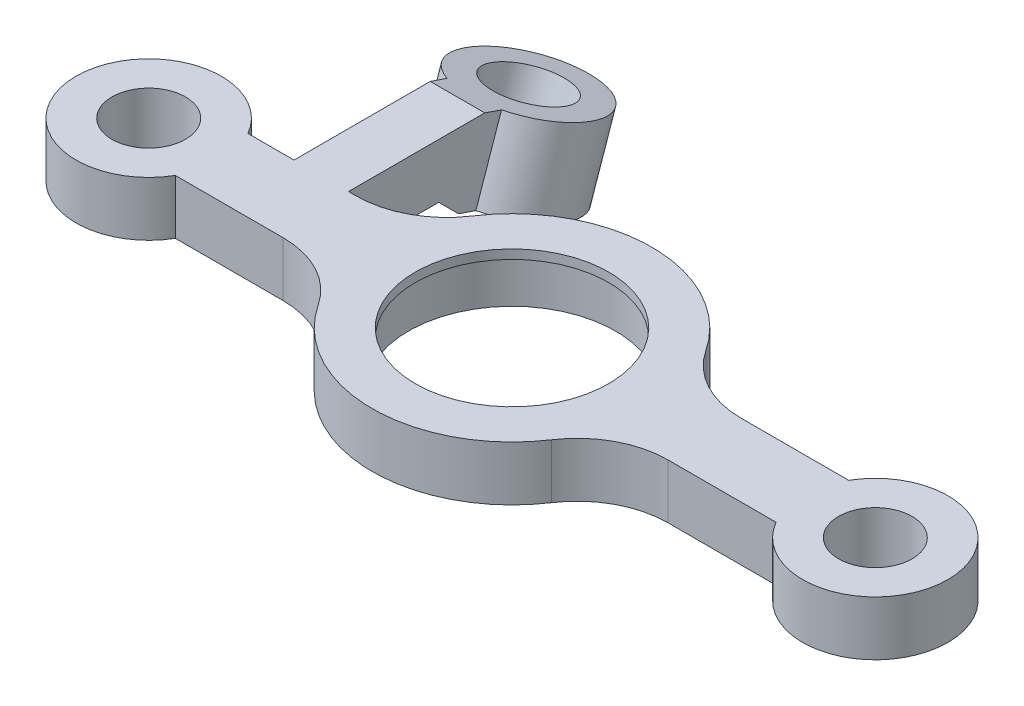
ISO-10303-21;
HEADER;
FILE_DESCRIPTION(('STEP AP214'),'2;1');
FILE_NAME('part.step','',(''),(''),'','','');
FILE_SCHEMA(('AUTOMOTIVE_DESIGN { 1 0 10303 214 1 1 1 1 }'));
ENDSEC;
DATA;
#1=APPLICATION_CONTEXT('core data for automotive mechanical design processes');
#2=APPLICATION_PROTOCOL_DEFINITION('international standard','automotive_design',2000,#1);
#3=PRODUCT_CONTEXT('',#1,'mechanical');
#4=PRODUCT('Part','Part','',(#3));
#5=PRODUCT_RELATED_PRODUCT_CATEGORY('part','',(#4));
#6=PRODUCT_DEFINITION_FORMATION('','',#4);
#7=PRODUCT_DEFINITION_CONTEXT('part definition',#1,'design');
#8=PRODUCT_DEFINITION('design','',#6,#7);
#9=PRODUCT_DEFINITION_SHAPE('','',#8);
#10=(LENGTH_UNIT() NAMED_UNIT(*) SI_UNIT(.MILLI.,.METRE.));
#11=(NAMED_UNIT(*) PLANE_ANGLE_UNIT() SI_UNIT($,.RADIAN.));
#12=(NAMED_UNIT(*) SI_UNIT($,.STERADIAN.) SOLID_ANGLE_UNIT());
#13=UNCERTAINTY_MEASURE_WITH_UNIT(LENGTH_MEASURE(1.E-05),#10,'distance_accuracy_value','');
#14=(GEOMETRIC_REPRESENTATION_CONTEXT(3) GLOBAL_UNCERTAINTY_ASSIGNED_CONTEXT((#13)) GLOBAL_UNIT_ASSIGNED_CONTEXT((#10,
#11,#12)) REPRESENTATION_CONTEXT('',''));
#15=CARTESIAN_POINT('',(0.,0.,0.));
#16=DIRECTION('',(0.,0.,1.));
#17=DIRECTION('',(1.,0.,0.));
#18=AXIS2_PLACEMENT_3D('',#15,#16,#17);
#19=CARTESIAN_POINT('',(-40.,0.,0.));
#20=DIRECTION('',(0.,1.,0.));
#21=DIRECTION('',(0.,0.,1.));
#22=AXIS2_PLACEMENT_3D('',#19,#20,#21);
#23=PLANE('',#22);
#24=CARTESIAN_POINT('',(0.,0.,0.));
#25=DIRECTION('',(0.,1.,0.));
#26=DIRECTION('',(0.,0.,1.));
#27=AXIS2_PLACEMENT_3D('',#24,#25,#26);
#28=CIRCLE('',#27,11.4);
#29=CARTESIAN_POINT('',(0.,0.,11.4));
#30=VERTEX_POINT('',#29);
#31=EDGE_CURVE('E208',#30,#30,#28,.T.);
#32=ORIENTED_EDGE('',*,*,#31,.T.);
#33=EDGE_LOOP('',(#32));
#34=FACE_BOUND('',#33,.T.);
#35=CARTESIAN_POINT('',(-40.,0.,0.));
#36=DIRECTION('',(0.,1.,0.));
#37=DIRECTION('',(0.,0.,1.));
#38=AXIS2_PLACEMENT_3D('',#35,#36,#37);
#39=CIRCLE('',#38,4.05);
#40=CARTESIAN_POINT('',(-40.,0.,4.05));
#41=VERTEX_POINT('',#40);
#42=EDGE_CURVE('E211',#41,#41,#39,.T.);
#43=ORIENTED_EDGE('',*,*,#42,.T.);
#44=EDGE_LOOP('',(#43));
#45=FACE_BOUND('',#44,.T.);
#46=CARTESIAN_POINT('',(40.,0.,0.));
#47=DIRECTION('',(0.,1.,0.));
#48=DIRECTION('',(0.,0.,1.));
#49=AXIS2_PLACEMENT_3D('',#46,#47,#48);
#50=CIRCLE('',#49,4.05);
#51=CARTESIAN_POINT('',(40.,0.,4.05));
#52=VERTEX_POINT('',#51);
#53=EDGE_CURVE('E215',#52,#52,#50,.T.);
#54=ORIENTED_EDGE('',*,*,#53,.T.);
#55=EDGE_LOOP('',(#54));
#56=FACE_BOUND('',#55,.T.);
#57=DIRECTION('',(0.,0.,1.));
#58=VECTOR('',#57,1.);
#59=CARTESIAN_POINT('',(-28.,0.,-4.));
#60=LINE('',#59,#58);
#61=CARTESIAN_POINT('',(-28.,0.,-13.934034320262));
#62=VERTEX_POINT('',#61);
#63=CARTESIAN_POINT('',(-28.,0.,-4.));
#64=VERTEX_POINT('',#63);
#65=EDGE_CURVE('E284',#62,#64,#60,.T.);
#66=ORIENTED_EDGE('',*,*,#65,.F.);
#67=DIRECTION('',(1.,0.,0.));
#68=VECTOR('',#67,1.);
#69=CARTESIAN_POINT('',(-22.,0.,-13.934034320262));
#70=LINE('',#69,#68);
#71=CARTESIAN_POINT('',(-22.,0.,-13.934034320262));
#72=VERTEX_POINT('',#71);
#73=EDGE_CURVE('E328',#62,#72,#70,.T.);
#74=ORIENTED_EDGE('',*,*,#73,.T.);
#75=DIRECTION('',(0.,0.,-1.));
#76=VECTOR('',#75,1.);
#77=CARTESIAN_POINT('',(-22.,0.,-19.));
#78=LINE('',#77,#76);
#79=CARTESIAN_POINT('',(-22.,0.,-4.));
#80=VERTEX_POINT('',#79);
#81=EDGE_CURVE('E282',#80,#72,#78,.T.);
#82=ORIENTED_EDGE('',*,*,#81,.F.);
#83=DIRECTION('',(-1.,0.,0.));
#84=VECTOR('',#83,1.);
#85=CARTESIAN_POINT('',(-22.,0.,-4.));
#86=LINE('',#85,#84);
#87=CARTESIAN_POINT('',(-21.193395197561,0.,-4.));
#88=VERTEX_POINT('',#87);
#89=EDGE_CURVE('E280',#88,#80,#86,.T.);
#90=ORIENTED_EDGE('',*,*,#89,.F.);
#91=CARTESIAN_POINT('',(-21.193395197561,0.,-14.));
#92=DIRECTION('',(0.,-1.,0.));
#93=DIRECTION('',(0.,0.,-1.));
#94=AXIS2_PLACEMENT_3D('',#91,#92,#93);
#95=CIRCLE('',#94,10.);
#96=CARTESIAN_POINT('',(-12.8495388205685,0.,-8.48818897637796));
#97=VERTEX_POINT('',#96);
#98=EDGE_CURVE('E278',#97,#88,#95,.T.);
#99=ORIENTED_EDGE('',*,*,#98,.F.);
#100=CARTESIAN_POINT('',(0.,0.,0.));
#101=DIRECTION('',(0.,1.,0.));
#102=DIRECTION('',(0.,0.,1.));
#103=AXIS2_PLACEMENT_3D('',#100,#101,#102);
#104=CIRCLE('',#103,15.4);
#105=CARTESIAN_POINT('',(12.8495388205685,0.,-8.48818897637795));
#106=VERTEX_POINT('',#105);
#107=EDGE_CURVE('E276',#106,#97,#104,.T.);
#108=ORIENTED_EDGE('',*,*,#107,.F.);
#109=CARTESIAN_POINT('',(21.193395197561,0.,-14.));
#110=DIRECTION('',(0.,-1.,0.));
#111=DIRECTION('',(0.,0.,-1.));
#112=AXIS2_PLACEMENT_3D('',#109,#110,#111);
#113=CIRCLE('',#112,10.);
#114=CARTESIAN_POINT('',(21.193395197561,0.,-4.));
#115=VERTEX_POINT('',#114);
#116=EDGE_CURVE('E274',#115,#106,#113,.T.);
#117=ORIENTED_EDGE('',*,*,#116,.F.);
#118=DIRECTION('',(-1.,0.,0.));
#119=VECTOR('',#118,1.);
#120=CARTESIAN_POINT('',(21.193395197561,0.,-4.));
#121=LINE('',#120,#119);
#122=CARTESIAN_POINT('',(33.0717967697245,0.,-3.99999999999999));
#123=VERTEX_POINT('',#122);
#124=EDGE_CURVE('E272',#123,#115,#121,.T.);
#125=ORIENTED_EDGE('',*,*,#124,.F.);
#126=CARTESIAN_POINT('',(40.,0.,0.));
#127=DIRECTION('',(0.,1.,0.));
#128=DIRECTION('',(0.,0.,1.));
#129=AXIS2_PLACEMENT_3D('',#126,#127,#128);
#130=CIRCLE('',#129,8.00000000000001);
#131=CARTESIAN_POINT('',(33.0717967697245,0.,3.99999999999999));
#132=VERTEX_POINT('',#131);
#133=EDGE_CURVE('E270',#132,#123,#130,.T.);
#134=ORIENTED_EDGE('',*,*,#133,.F.);
#135=DIRECTION('',(1.,0.,0.));
#136=VECTOR('',#135,1.);
#137=CARTESIAN_POINT('',(21.193395197561,0.,4.));
#138=LINE('',#137,#136);
#139=CARTESIAN_POINT('',(21.193395197561,0.,4.));
#140=VERTEX_POINT('',#139);
#141=EDGE_CURVE('E268',#140,#132,#138,.T.);
#142=ORIENTED_EDGE('',*,*,#141,.F.);
#143=CARTESIAN_POINT('',(21.193395197561,0.,14.));
#144=DIRECTION('',(0.,-1.,0.));
#145=DIRECTION('',(0.,0.,1.));
#146=AXIS2_PLACEMENT_3D('',#143,#144,#145);
#147=CIRCLE('',#146,10.);
#148=CARTESIAN_POINT('',(12.8495388205685,0.,8.48818897637795));
#149=VERTEX_POINT('',#148);
#150=EDGE_CURVE('E266',#149,#140,#147,.T.);
#151=ORIENTED_EDGE('',*,*,#150,.F.);
#152=CARTESIAN_POINT('',(0.,0.,0.));
#153=DIRECTION('',(0.,1.,0.));
#154=DIRECTION('',(0.,0.,1.));
#155=AXIS2_PLACEMENT_3D('',#152,#153,#154);
#156=CIRCLE('',#155,15.4);
#157=CARTESIAN_POINT('',(-12.8495388205685,0.,8.48818897637796));
#158=VERTEX_POINT('',#157);
#159=EDGE_CURVE('E264',#158,#149,#156,.T.);
#160=ORIENTED_EDGE('',*,*,#159,.F.);
#161=CARTESIAN_POINT('',(-21.193395197561,0.,14.));
#162=DIRECTION('',(0.,-1.,0.));
#163=DIRECTION('',(0.,0.,1.));
#164=AXIS2_PLACEMENT_3D('',#161,#162,#163);
#165=CIRCLE('',#164,10.);
#166=CARTESIAN_POINT('',(-21.193395197561,0.,4.));
#167=VERTEX_POINT('',#166);
#168=EDGE_CURVE('E262',#167,#158,#165,.T.);
#169=ORIENTED_EDGE('',*,*,#168,.F.);
#170=DIRECTION('',(1.,0.,0.));
#171=VECTOR('',#170,1.);
#172=CARTESIAN_POINT('',(-33.0717967697245,0.,4.));
#173=LINE('',#172,#171);
#174=CARTESIAN_POINT('',(-33.0717967697245,0.,4.));
#175=VERTEX_POINT('',#174);
#176=EDGE_CURVE('E260',#175,#167,#173,.T.);
#177=ORIENTED_EDGE('',*,*,#176,.F.);
#178=CARTESIAN_POINT('',(-40.,0.,0.));
#179=DIRECTION('',(0.,1.,0.));
#180=DIRECTION('',(0.,0.,1.));
#181=AXIS2_PLACEMENT_3D('',#178,#179,#180);
#182=CIRCLE('',#181,8.00000000000001);
#183=CARTESIAN_POINT('',(-33.0717967697245,0.,-3.99999999999998));
#184=VERTEX_POINT('',#183);
#185=EDGE_CURVE('E221',#184,#175,#182,.T.);
#186=ORIENTED_EDGE('',*,*,#185,.F.);
#187=DIRECTION('',(-1.,0.,0.));
#188=VECTOR('',#187,1.);
#189=CARTESIAN_POINT('',(-33.0717967697245,0.,-3.99999999999998));
#190=LINE('',#189,#188);
#191=EDGE_CURVE('E228',#64,#184,#190,.T.);
#192=ORIENTED_EDGE('',*,*,#191,.F.);
#193=EDGE_LOOP('',(#66,#74,#82,#90,#99,#108,#117,#125,#134,#142,#151,#160,#169,#177,#186,#192));
#194=FACE_BOUND('',#193,.T.);
#195=ADVANCED_FACE('F33',(#34,#45,#56,#194),#23,.F.);
#196=CARTESIAN_POINT('',(0.,6.,0.));
#197=DIRECTION('',(0.,-1.,0.));
#198=DIRECTION('',(0.,0.,-1.));
#199=AXIS2_PLACEMENT_3D('',#196,#197,#198);
#200=CYLINDRICAL_SURFACE('',#199,11.4);
#201=ORIENTED_EDGE('',*,*,#31,.F.);
#202=EDGE_LOOP('',(#201));
#203=FACE_BOUND('',#202,.T.);
#204=CARTESIAN_POINT('',(0.,5.,0.));
#205=DIRECTION('',(0.,1.,0.));
#206=DIRECTION('',(0.,0.,1.));
#207=AXIS2_PLACEMENT_3D('',#204,#205,#206);
#208=CIRCLE('',#207,11.4);
#209=CARTESIAN_POINT('',(0.,5.,11.4));
#210=VERTEX_POINT('',#209);
#211=EDGE_CURVE('E203',#210,#210,#208,.T.);
#212=ORIENTED_EDGE('',*,*,#211,.T.);
#213=EDGE_LOOP('',(#212));
#214=FACE_BOUND('',#213,.T.);
#215=ADVANCED_FACE('F409',(#203,#214),#200,.F.);
#216=CARTESIAN_POINT('',(-40.,6.,0.));
#217=DIRECTION('',(0.,1.,0.));
#218=DIRECTION('',(0.,0.,1.));
#219=AXIS2_PLACEMENT_3D('',#216,#217,#218);
#220=PLANE('',#219);
#221=CARTESIAN_POINT('',(-40.,6.,0.));
#222=DIRECTION('',(0.,1.,0.));
#223=DIRECTION('',(0.,0.,1.));
#224=AXIS2_PLACEMENT_3D('',#221,#222,#223);
#225=CIRCLE('',#224,4.05);
#226=CARTESIAN_POINT('',(-40.,6.,4.05));
#227=VERTEX_POINT('',#226);
#228=EDGE_CURVE('E212',#227,#227,#225,.T.);
#229=ORIENTED_EDGE('',*,*,#228,.F.);
#230=EDGE_LOOP('',(#229));
#231=FACE_BOUND('',#230,.T.);
#232=CARTESIAN_POINT('',(-40.,6.,0.));
#233=DIRECTION('',(0.,1.,0.));
#234=DIRECTION('',(0.,0.,1.));
#235=AXIS2_PLACEMENT_3D('',#232,#233,#234);
#236=CIRCLE('',#235,8.00000000000001);
#237=CARTESIAN_POINT('',(-33.0717967697245,6.,-3.99999999999998));
#238=VERTEX_POINT('',#237);
#239=CARTESIAN_POINT('',(-33.0717967697245,6.,4.));
#240=VERTEX_POINT('',#239);
#241=EDGE_CURVE('E224',#238,#240,#236,.T.);
#242=ORIENTED_EDGE('',*,*,#241,.T.);
#243=DIRECTION('',(1.,0.,0.));
#244=VECTOR('',#243,1.);
#245=CARTESIAN_POINT('',(-33.0717967697245,6.,4.));
#246=LINE('',#245,#244);
#247=CARTESIAN_POINT('',(-21.193395197561,6.,4.));
#248=VERTEX_POINT('',#247);
#249=EDGE_CURVE('E227',#240,#248,#246,.T.);
#250=ORIENTED_EDGE('',*,*,#249,.T.);
#251=CARTESIAN_POINT('',(-21.193395197561,6.,14.));
#252=DIRECTION('',(0.,-1.,0.));
#253=DIRECTION('',(0.,0.,1.));
#254=AXIS2_PLACEMENT_3D('',#251,#252,#253);
#255=CIRCLE('',#254,10.);
#256=CARTESIAN_POINT('',(-12.8495388205685,6.,8.48818897637796));
#257=VERTEX_POINT('',#256);
#258=EDGE_CURVE('E230',#248,#257,#255,.T.);
#259=ORIENTED_EDGE('',*,*,#258,.T.);
#260=CARTESIAN_POINT('',(0.,6.,0.));
#261=DIRECTION('',(0.,1.,0.));
#262=DIRECTION('',(0.,0.,1.));
#263=AXIS2_PLACEMENT_3D('',#260,#261,#262);
#264=CIRCLE('',#263,15.4);
#265=CARTESIAN_POINT('',(12.8495388205685,6.,8.48818897637795));
#266=VERTEX_POINT('',#265);
#267=EDGE_CURVE('E232',#257,#266,#264,.T.);
#268=ORIENTED_EDGE('',*,*,#267,.T.);
#269=CARTESIAN_POINT('',(21.193395197561,6.,14.));
#270=DIRECTION('',(0.,-1.,0.));
#271=DIRECTION('',(0.,0.,1.));
#272=AXIS2_PLACEMENT_3D('',#269,#270,#271);
#273=CIRCLE('',#272,10.);
#274=CARTESIAN_POINT('',(21.193395197561,6.,4.));
#275=VERTEX_POINT('',#274);
#276=EDGE_CURVE('E234',#266,#275,#273,.T.);
#277=ORIENTED_EDGE('',*,*,#276,.T.);
#278=DIRECTION('',(1.,0.,0.));
#279=VECTOR('',#278,1.);
#280=CARTESIAN_POINT('',(21.193395197561,6.,4.));
#281=LINE('',#280,#279);
#282=CARTESIAN_POINT('',(33.0717967697245,6.,3.99999999999999));
#283=VERTEX_POINT('',#282);
#284=EDGE_CURVE('E236',#275,#283,#281,.T.);
#285=ORIENTED_EDGE('',*,*,#284,.T.);
#286=CARTESIAN_POINT('',(40.,6.,0.));
#287=DIRECTION('',(0.,1.,0.));
#288=DIRECTION('',(0.,0.,1.));
#289=AXIS2_PLACEMENT_3D('',#286,#287,#288);
#290=CIRCLE('',#289,8.00000000000001);
#291=CARTESIAN_POINT('',(33.0717967697245,6.,-3.99999999999999));
#292=VERTEX_POINT('',#291);
#293=EDGE_CURVE('E238',#283,#292,#290,.T.);
#294=ORIENTED_EDGE('',*,*,#293,.T.);
#295=DIRECTION('',(-1.,0.,0.));
#296=VECTOR('',#295,1.);
#297=CARTESIAN_POINT('',(21.193395197561,6.,-4.));
#298=LINE('',#297,#296);
#299=CARTESIAN_POINT('',(21.193395197561,6.,-4.));
#300=VERTEX_POINT('',#299);
#301=EDGE_CURVE('E240',#292,#300,#298,.T.);
#302=ORIENTED_EDGE('',*,*,#301,.T.);
#303=CARTESIAN_POINT('',(21.193395197561,6.,-14.));
#304=DIRECTION('',(0.,-1.,0.));
#305=DIRECTION('',(0.,0.,-1.));
#306=AXIS2_PLACEMENT_3D('',#303,#304,#305);
#307=CIRCLE('',#306,10.);
#308=CARTESIAN_POINT('',(12.8495388205685,6.,-8.48818897637795));
#309=VERTEX_POINT('',#308);
#310=EDGE_CURVE('E242',#300,#309,#307,.T.);
#311=ORIENTED_EDGE('',*,*,#310,.T.);
#312=CARTESIAN_POINT('',(0.,6.,0.));
#313=DIRECTION('',(0.,1.,0.));
#314=DIRECTION('',(0.,0.,1.));
#315=AXIS2_PLACEMENT_3D('',#312,#313,#314);
#316=CIRCLE('',#315,15.4);
#317=CARTESIAN_POINT('',(-12.8495388205685,6.,-8.48818897637796));
#318=VERTEX_POINT('',#317);
#319=EDGE_CURVE('E244',#309,#318,#316,.T.);
#320=ORIENTED_EDGE('',*,*,#319,.T.);
#321=CARTESIAN_POINT('',(-21.193395197561,6.,-14.));
#322=DIRECTION('',(0.,-1.,0.));
#323=DIRECTION('',(0.,0.,-1.));
#324=AXIS2_PLACEMENT_3D('',#321,#322,#323);
#325=CIRCLE('',#324,10.);
#326=CARTESIAN_POINT('',(-21.193395197561,6.,-4.));
#327=VERTEX_POINT('',#326);
#328=EDGE_CURVE('E246',#318,#327,#325,.T.);
#329=ORIENTED_EDGE('',*,*,#328,.T.);
#330=DIRECTION('',(-1.,0.,0.));
#331=VECTOR('',#330,1.);
#332=CARTESIAN_POINT('',(-22.,6.,-4.));
#333=LINE('',#332,#331);
#334=CARTESIAN_POINT('',(-22.,6.,-4.));
#335=VERTEX_POINT('',#334);
#336=EDGE_CURVE('E248',#327,#335,#333,.T.);
#337=ORIENTED_EDGE('',*,*,#336,.T.);
#338=DIRECTION('',(0.,0.,-1.));
#339=VECTOR('',#338,1.);
#340=CARTESIAN_POINT('',(-22.,6.,-19.));
#341=LINE('',#340,#339);
#342=CARTESIAN_POINT('',(-22.,6.,-19.));
#343=VERTEX_POINT('',#342);
#344=EDGE_CURVE('E250',#335,#343,#341,.T.);
#345=ORIENTED_EDGE('',*,*,#344,.T.);
#346=DIRECTION('',(-1.,0.,0.));
#347=VECTOR('',#346,1.);
#348=CARTESIAN_POINT('',(-28.,6.,-19.));
#349=LINE('',#348,#347);
#350=CARTESIAN_POINT('',(-28.,6.,-19.));
#351=VERTEX_POINT('',#350);
#352=EDGE_CURVE('E182',#343,#351,#349,.T.);
#353=ORIENTED_EDGE('',*,*,#352,.T.);
#354=DIRECTION('',(0.,0.,1.));
#355=VECTOR('',#354,1.);
#356=CARTESIAN_POINT('',(-28.,6.,-4.));
#357=LINE('',#356,#355);
#358=CARTESIAN_POINT('',(-28.,6.,-4.));
#359=VERTEX_POINT('',#358);
#360=EDGE_CURVE('E253',#351,#359,#357,.T.);
#361=ORIENTED_EDGE('',*,*,#360,.T.);
#362=DIRECTION('',(-1.,0.,0.));
#363=VECTOR('',#362,1.);
#364=CARTESIAN_POINT('',(-33.0717967697245,6.,-3.99999999999998));
#365=LINE('',#364,#363);
#366=EDGE_CURVE('E255',#359,#238,#365,.T.);
#367=ORIENTED_EDGE('',*,*,#366,.T.);
#368=EDGE_LOOP('',(#242,#250,#259,#268,#277,#285,#294,#302,#311,#320,#329,#337,#345,#353,#361,#367));
#369=FACE_BOUND('',#368,.T.);
#370=CARTESIAN_POINT('',(40.,6.,0.));
#371=DIRECTION('',(0.,1.,0.));
#372=DIRECTION('',(0.,0.,1.));
#373=AXIS2_PLACEMENT_3D('',#370,#371,#372);
#374=CIRCLE('',#373,4.05);
#375=CARTESIAN_POINT('',(40.,6.,4.05));
#376=VERTEX_POINT('',#375);
#377=EDGE_CURVE('E218',#376,#376,#374,.T.);
#378=ORIENTED_EDGE('',*,*,#377,.F.);
#379=EDGE_LOOP('',(#378));
#380=FACE_BOUND('',#379,.T.);
#381=CARTESIAN_POINT('',(0.,6.,0.));
#382=DIRECTION('',(0.,1.,0.));
#383=DIRECTION('',(0.,0.,1.));
#384=AXIS2_PLACEMENT_3D('',#381,#382,#383);
#385=CIRCLE('',#384,10.65);
#386=CARTESIAN_POINT('',(0.,6.,10.65));
#387=VERTEX_POINT('',#386);
#388=EDGE_CURVE('E173',#387,#387,#385,.T.);
#389=ORIENTED_EDGE('',*,*,#388,.F.);
#390=EDGE_LOOP('',(#389));
#391=FACE_BOUND('',#390,.T.);
#392=ADVANCED_FACE('F406',(#231,#369,#380,#391),#220,.T.);
#393=CARTESIAN_POINT('',(-40.,6.,0.));
#394=DIRECTION('',(0.,-1.,0.));
#395=DIRECTION('',(0.,0.,-1.));
#396=AXIS2_PLACEMENT_3D('',#393,#394,#395);
#397=CYLINDRICAL_SURFACE('',#396,8.00000000000001);
#398=ORIENTED_EDGE('',*,*,#185,.T.);
#399=DIRECTION('',(0.,-1.,0.));
#400=VECTOR('',#399,1.);
#401=CARTESIAN_POINT('',(-33.0717967697245,6.,4.));
#402=LINE('',#401,#400);
#403=EDGE_CURVE('E325',#240,#175,#402,.T.);
#404=ORIENTED_EDGE('',*,*,#403,.F.);
#405=ORIENTED_EDGE('',*,*,#241,.F.);
#406=DIRECTION('',(0.,-1.,0.));
#407=VECTOR('',#406,1.);
#408=CARTESIAN_POINT('',(-33.0717967697245,6.,-3.99999999999998));
#409=LINE('',#408,#407);
#410=EDGE_CURVE('E257',#238,#184,#409,.T.);
#411=ORIENTED_EDGE('',*,*,#410,.T.);
#412=EDGE_LOOP('',(#398,#404,#405,#411));
#413=FACE_BOUND('',#412,.T.);
#414=ADVANCED_FACE('F399',(#413),#397,.T.);
#415=CARTESIAN_POINT('',(-33.0717967697245,6.,4.));
#416=DIRECTION('',(0.,0.,-1.));
#417=DIRECTION('',(-1.,0.,0.));
#418=AXIS2_PLACEMENT_3D('',#415,#416,#417);
#419=PLANE('',#418);
#420=ORIENTED_EDGE('',*,*,#176,.T.);
#421=DIRECTION('',(0.,-1.,0.));
#422=VECTOR('',#421,1.);
#423=CARTESIAN_POINT('',(-21.193395197561,6.,4.));
#424=LINE('',#423,#422);
#425=EDGE_CURVE('E322',#248,#167,#424,.T.);
#426=ORIENTED_EDGE('',*,*,#425,.F.);
#427=ORIENTED_EDGE('',*,*,#249,.F.);
#428=ORIENTED_EDGE('',*,*,#403,.T.);
#429=EDGE_LOOP('',(#420,#426,#427,#428));
#430=FACE_BOUND('',#429,.T.);
#431=ADVANCED_FACE('F395',(#430),#419,.F.);
#432=CARTESIAN_POINT('',(-21.193395197561,6.,14.));
#433=DIRECTION('',(0.,-1.,0.));
#434=DIRECTION('',(0.,0.,-1.));
#435=AXIS2_PLACEMENT_3D('',#432,#433,#434);
#436=CYLINDRICAL_SURFACE('',#435,10.);
#437=ORIENTED_EDGE('',*,*,#168,.T.);
#438=DIRECTION('',(0.,-1.,0.));
#439=VECTOR('',#438,1.);
#440=CARTESIAN_POINT('',(-12.8495388205685,6.,8.48818897637796));
#441=LINE('',#440,#439);
#442=EDGE_CURVE('E319',#257,#158,#441,.T.);
#443=ORIENTED_EDGE('',*,*,#442,.F.);
#444=ORIENTED_EDGE('',*,*,#258,.F.);
#445=ORIENTED_EDGE('',*,*,#425,.T.);
#446=EDGE_LOOP('',(#437,#443,#444,#445));
#447=FACE_BOUND('',#446,.T.);
#448=ADVANCED_FACE('F391',(#447),#436,.F.);
#449=CARTESIAN_POINT('',(0.,6.,0.));
#450=DIRECTION('',(0.,-1.,0.));
#451=DIRECTION('',(0.,0.,-1.));
#452=AXIS2_PLACEMENT_3D('',#449,#450,#451);
#453=CYLINDRICAL_SURFACE('',#452,15.4);
#454=ORIENTED_EDGE('',*,*,#159,.T.);
#455=DIRECTION('',(0.,-1.,0.));
#456=VECTOR('',#455,1.);
#457=CARTESIAN_POINT('',(12.8495388205685,6.,8.48818897637795));
#458=LINE('',#457,#456);
#459=EDGE_CURVE('E316',#266,#149,#458,.T.);
#460=ORIENTED_EDGE('',*,*,#459,.F.);
#461=ORIENTED_EDGE('',*,*,#267,.F.);
#462=ORIENTED_EDGE('',*,*,#442,.T.);
#463=EDGE_LOOP('',(#454,#460,#461,#462));
#464=FACE_BOUND('',#463,.T.);
#465=ADVANCED_FACE('F387',(#464),#453,.T.);
#466=CARTESIAN_POINT('',(21.193395197561,6.,14.));
#467=DIRECTION('',(0.,-1.,0.));
#468=DIRECTION('',(0.,0.,-1.));
#469=AXIS2_PLACEMENT_3D('',#466,#467,#468);
#470=CYLINDRICAL_SURFACE('',#469,10.);
#471=ORIENTED_EDGE('',*,*,#150,.T.);
#472=DIRECTION('',(0.,-1.,0.));
#473=VECTOR('',#472,1.);
#474=CARTESIAN_POINT('',(21.193395197561,6.,4.));
#475=LINE('',#474,#473);
#476=EDGE_CURVE('E313',#275,#140,#475,.T.);
#477=ORIENTED_EDGE('',*,*,#476,.F.);
#478=ORIENTED_EDGE('',*,*,#276,.F.);
#479=ORIENTED_EDGE('',*,*,#459,.T.);
#480=EDGE_LOOP('',(#471,#477,#478,#479));
#481=FACE_BOUND('',#480,.T.);
#482=ADVANCED_FACE('F383',(#481),#470,.F.);
#483=CARTESIAN_POINT('',(21.193395197561,6.,4.));
#484=DIRECTION('',(0.,0.,-1.));
#485=DIRECTION('',(-1.,0.,0.));
#486=AXIS2_PLACEMENT_3D('',#483,#484,#485);
#487=PLANE('',#486);
#488=ORIENTED_EDGE('',*,*,#141,.T.);
#489=DIRECTION('',(0.,-1.,0.));
#490=VECTOR('',#489,1.);
#491=CARTESIAN_POINT('',(33.0717967697245,6.,3.99999999999999));
#492=LINE('',#491,#490);
#493=EDGE_CURVE('E310',#283,#132,#492,.T.);
#494=ORIENTED_EDGE('',*,*,#493,.F.);
#495=ORIENTED_EDGE('',*,*,#284,.F.);
#496=ORIENTED_EDGE('',*,*,#476,.T.);
#497=EDGE_LOOP('',(#488,#494,#495,#496));
#498=FACE_BOUND('',#497,.T.);
#499=ADVANCED_FACE('F378',(#498),#487,.F.);
#500=CARTESIAN_POINT('',(40.,6.,0.));
#501=DIRECTION('',(0.,-1.,0.));
#502=DIRECTION('',(0.,0.,-1.));
#503=AXIS2_PLACEMENT_3D('',#500,#501,#502);
#504=CYLINDRICAL_SURFACE('',#503,8.00000000000001);
#505=ORIENTED_EDGE('',*,*,#133,.T.);
#506=DIRECTION('',(0.,-1.,0.));
#507=VECTOR('',#506,1.);
#508=CARTESIAN_POINT('',(33.0717967697245,6.,-3.99999999999999));
#509=LINE('',#508,#507);
#510=EDGE_CURVE('E307',#292,#123,#509,.T.);
#511=ORIENTED_EDGE('',*,*,#510,.F.);
#512=ORIENTED_EDGE('',*,*,#293,.F.);
#513=ORIENTED_EDGE('',*,*,#493,.T.);
#514=EDGE_LOOP('',(#505,#511,#512,#513));
#515=FACE_BOUND('',#514,.T.);
#516=ADVANCED_FACE('F372',(#515),#504,.T.);
#517=CARTESIAN_POINT('',(21.193395197561,6.,-4.));
#518=DIRECTION('',(0.,0.,1.));
#519=DIRECTION('',(1.,0.,0.));
#520=AXIS2_PLACEMENT_3D('',#517,#518,#519);
#521=PLANE('',#520);
#522=ORIENTED_EDGE('',*,*,#124,.T.);
#523=DIRECTION('',(0.,-1.,0.));
#524=VECTOR('',#523,1.);
#525=CARTESIAN_POINT('',(21.193395197561,6.,-4.));
#526=LINE('',#525,#524);
#527=EDGE_CURVE('E304',#300,#115,#526,.T.);
#528=ORIENTED_EDGE('',*,*,#527,.F.);
#529=ORIENTED_EDGE('',*,*,#301,.F.);
#530=ORIENTED_EDGE('',*,*,#510,.T.);
#531=EDGE_LOOP('',(#522,#528,#529,#530));
#532=FACE_BOUND('',#531,.T.);
#533=ADVANCED_FACE('F368',(#532),#521,.F.);
#534=CARTESIAN_POINT('',(21.193395197561,6.,-14.));
#535=DIRECTION('',(0.,-1.,0.));
#536=DIRECTION('',(0.,0.,-1.));
#537=AXIS2_PLACEMENT_3D('',#534,#535,#536);
#538=CYLINDRICAL_SURFACE('',#537,10.);
#539=ORIENTED_EDGE('',*,*,#116,.T.);
#540=DIRECTION('',(0.,-1.,0.));
#541=VECTOR('',#540,1.);
#542=CARTESIAN_POINT('',(12.8495388205685,6.,-8.48818897637795));
#543=LINE('',#542,#541);
#544=EDGE_CURVE('E301',#309,#106,#543,.T.);
#545=ORIENTED_EDGE('',*,*,#544,.F.);
#546=ORIENTED_EDGE('',*,*,#310,.F.);
#547=ORIENTED_EDGE('',*,*,#527,.T.);
#548=EDGE_LOOP('',(#539,#545,#546,#547));
#549=FACE_BOUND('',#548,.T.);
#550=ADVANCED_FACE('F363',(#549),#538,.F.);
#551=CARTESIAN_POINT('',(0.,6.,0.));
#552=DIRECTION('',(0.,-1.,0.));
#553=DIRECTION('',(0.,0.,-1.));
#554=AXIS2_PLACEMENT_3D('',#551,#552,#553);
#555=CYLINDRICAL_SURFACE('',#554,15.4);
#556=ORIENTED_EDGE('',*,*,#107,.T.);
#557=DIRECTION('',(0.,-1.,0.));
#558=VECTOR('',#557,1.);
#559=CARTESIAN_POINT('',(-12.8495388205685,6.,-8.48818897637796));
#560=LINE('',#559,#558);
#561=EDGE_CURVE('E298',#318,#97,#560,.T.);
#562=ORIENTED_EDGE('',*,*,#561,.F.);
#563=ORIENTED_EDGE('',*,*,#319,.F.);
#564=ORIENTED_EDGE('',*,*,#544,.T.);
#565=EDGE_LOOP('',(#556,#562,#563,#564));
#566=FACE_BOUND('',#565,.T.);
#567=ADVANCED_FACE('F357',(#566),#555,.T.);
#568=CARTESIAN_POINT('',(-21.193395197561,6.,-14.));
#569=DIRECTION('',(0.,-1.,0.));
#570=DIRECTION('',(0.,0.,-1.));
#571=AXIS2_PLACEMENT_3D('',#568,#569,#570);
#572=CYLINDRICAL_SURFACE('',#571,10.);
#573=ORIENTED_EDGE('',*,*,#98,.T.);
#574=DIRECTION('',(0.,-1.,0.));
#575=VECTOR('',#574,1.);
#576=CARTESIAN_POINT('',(-21.193395197561,6.,-4.));
#577=LINE('',#576,#575);
#578=EDGE_CURVE('E295',#327,#88,#577,.T.);
#579=ORIENTED_EDGE('',*,*,#578,.F.);
#580=ORIENTED_EDGE('',*,*,#328,.F.);
#581=ORIENTED_EDGE('',*,*,#561,.T.);
#582=EDGE_LOOP('',(#573,#579,#580,#581));
#583=FACE_BOUND('',#582,.T.);
#584=ADVANCED_FACE('F353',(#583),#572,.F.);
#585=CARTESIAN_POINT('',(-22.,6.,-4.));
#586=DIRECTION('',(0.,0.,1.));
#587=DIRECTION('',(1.,0.,0.));
#588=AXIS2_PLACEMENT_3D('',#585,#586,#587);
#589=PLANE('',#588);
#590=ORIENTED_EDGE('',*,*,#89,.T.);
#591=DIRECTION('',(0.,-1.,0.));
#592=VECTOR('',#591,1.);
#593=CARTESIAN_POINT('',(-22.,6.,-4.));
#594=LINE('',#593,#592);
#595=EDGE_CURVE('E292',#335,#80,#594,.T.);
#596=ORIENTED_EDGE('',*,*,#595,.F.);
#597=ORIENTED_EDGE('',*,*,#336,.F.);
#598=ORIENTED_EDGE('',*,*,#578,.T.);
#599=EDGE_LOOP('',(#590,#596,#597,#598));
#600=FACE_BOUND('',#599,.T.);
#601=ADVANCED_FACE('F348',(#600),#589,.F.);
#602=CARTESIAN_POINT('',(-22.,6.,-19.));
#603=DIRECTION('',(-1.,0.,0.));
#604=DIRECTION('',(0.,0.,1.));
#605=AXIS2_PLACEMENT_3D('',#602,#603,#604);
#606=PLANE('',#605);
#607=ORIENTED_EDGE('',*,*,#81,.T.);
#608=DIRECTION('',(0.,0.707106781186553,0.707106781186542));
#609=VECTOR('',#608,1.);
#610=CARTESIAN_POINT('',(-22.,0.467017160131053,-13.467017160131));
#611=LINE('',#610,#609);
#612=CARTESIAN_POINT('',(-22.,-2.17869503276727,-16.1127293530293));
#613=VERTEX_POINT('',#612);
#614=EDGE_CURVE('E11',#72,#613,#611,.F.);
#615=ORIENTED_EDGE('',*,*,#614,.T.);
#616=DIRECTION('',(0.,0.325568154457154,0.945518575599318));
#617=VECTOR('',#616,1.);
#618=CARTESIAN_POINT('',(-22.,-2.20058798761813,-16.1763111106516));
#619=LINE('',#618,#617);
#620=CARTESIAN_POINT('',(-22.,-2.83655572679795,-18.0232955366285));
#621=VERTEX_POINT('',#620);
#622=EDGE_CURVE('E48',#621,#613,#619,.T.);
#623=ORIENTED_EDGE('',*,*,#622,.F.);
#624=DIRECTION('',(0.,0.945518575599318,-0.325568154457154));
#625=VECTOR('',#624,1.);
#626=CARTESIAN_POINT('',(-22.,-2.83655572679795,-18.0232955366285));
#627=LINE('',#626,#625);
#628=CARTESIAN_POINT('',(-22.,5.36403226082018,-20.846984425977));
#629=VERTEX_POINT('',#628);
#630=EDGE_CURVE('E163',#621,#629,#627,.T.);
#631=ORIENTED_EDGE('',*,*,#630,.T.);
#632=DIRECTION('',(0.,0.325568154457154,0.945518575599318));
#633=VECTOR('',#632,1.);
#634=CARTESIAN_POINT('',(-22.,6.,-19.));
#635=LINE('',#634,#633);
#636=EDGE_CURVE('E168',#629,#343,#635,.T.);
#637=ORIENTED_EDGE('',*,*,#636,.T.);
#638=ORIENTED_EDGE('',*,*,#344,.F.);
#639=ORIENTED_EDGE('',*,*,#595,.T.);
#640=EDGE_LOOP('',(#607,#615,#623,#631,#637,#638,#639));
#641=FACE_BOUND('',#640,.T.);
#642=ADVANCED_FACE('F166',(#641),#606,.F.);
#643=CARTESIAN_POINT('',(-28.,6.,-4.));
#644=DIRECTION('',(1.,0.,0.));
#645=DIRECTION('',(0.,0.,-1.));
#646=AXIS2_PLACEMENT_3D('',#643,#644,#645);
#647=PLANE('',#646);
#648=DIRECTION('',(0.,-0.325568154457154,-0.945518575599318));
#649=VECTOR('',#648,1.);
#650=CARTESIAN_POINT('',(-28.,5.36403226082018,-20.846984425977));
#651=LINE('',#650,#649);
#652=CARTESIAN_POINT('',(-28.,5.36403226082018,-20.846984425977));
#653=VERTEX_POINT('',#652);
#654=EDGE_CURVE('E183',#351,#653,#651,.T.);
#655=ORIENTED_EDGE('',*,*,#654,.T.);
#656=DIRECTION('',(0.,0.945518575599318,-0.325568154457154));
#657=VECTOR('',#656,1.);
#658=CARTESIAN_POINT('',(-28.,-2.83655572679795,-18.0232955366285));
#659=LINE('',#658,#657);
#660=CARTESIAN_POINT('',(-28.,-2.83655572679795,-18.0232955366285));
#661=VERTEX_POINT('',#660);
#662=EDGE_CURVE('E174',#661,#653,#659,.T.);
#663=ORIENTED_EDGE('',*,*,#662,.F.);
#664=DIRECTION('',(0.,-0.325568154457154,-0.945518575599318));
#665=VECTOR('',#664,1.);
#666=CARTESIAN_POINT('',(-28.,-2.83655572679795,-18.0232955366285));
#667=LINE('',#666,#665);
#668=CARTESIAN_POINT('',(-28.,-2.17869503276727,-16.1127293530293));
#669=VERTEX_POINT('',#668);
#670=EDGE_CURVE('E55',#669,#661,#667,.T.);
#671=ORIENTED_EDGE('',*,*,#670,.F.);
#672=DIRECTION('',(0.,-0.707106781186553,-0.707106781186542));
#673=VECTOR('',#672,1.);
#674=CARTESIAN_POINT('',(-28.,7.96701716013105,-5.96701716013108));
#675=LINE('',#674,#673);
#676=EDGE_CURVE('E41',#669,#62,#675,.F.);
#677=ORIENTED_EDGE('',*,*,#676,.T.);
#678=ORIENTED_EDGE('',*,*,#65,.T.);
#679=DIRECTION('',(0.,-1.,0.));
#680=VECTOR('',#679,1.);
#681=CARTESIAN_POINT('',(-28.,6.,-4.));
#682=LINE('',#681,#680);
#683=EDGE_CURVE('E289',#359,#64,#682,.T.);
#684=ORIENTED_EDGE('',*,*,#683,.F.);
#685=ORIENTED_EDGE('',*,*,#360,.F.);
#686=EDGE_LOOP('',(#655,#663,#671,#677,#678,#684,#685));
#687=FACE_BOUND('',#686,.T.);
#688=ADVANCED_FACE('F334',(#687),#647,.F.);
#689=CARTESIAN_POINT('',(-33.0717967697245,6.,-3.99999999999998));
#690=DIRECTION('',(0.,0.,1.));
#691=DIRECTION('',(1.,0.,0.));
#692=AXIS2_PLACEMENT_3D('',#689,#690,#691);
#693=PLANE('',#692);
#694=ORIENTED_EDGE('',*,*,#191,.T.);
#695=ORIENTED_EDGE('',*,*,#410,.F.);
#696=ORIENTED_EDGE('',*,*,#366,.F.);
#697=ORIENTED_EDGE('',*,*,#683,.T.);
#698=EDGE_LOOP('',(#694,#695,#696,#697));
#699=FACE_BOUND('',#698,.T.);
#700=ADVANCED_FACE('F403',(#699),#693,.F.);
#701=CARTESIAN_POINT('',(40.,6.,0.));
#702=DIRECTION('',(0.,-1.,0.));
#703=DIRECTION('',(0.,0.,-1.));
#704=AXIS2_PLACEMENT_3D('',#701,#702,#703);
#705=CYLINDRICAL_SURFACE('',#704,4.05);
#706=ORIENTED_EDGE('',*,*,#377,.T.);
#707=EDGE_LOOP('',(#706));
#708=FACE_BOUND('',#707,.T.);
#709=ORIENTED_EDGE('',*,*,#53,.F.);
#710=EDGE_LOOP('',(#709));
#711=FACE_BOUND('',#710,.T.);
#712=ADVANCED_FACE('F445',(#708,#711),#705,.F.);
#713=CARTESIAN_POINT('',(-40.,6.,0.));
#714=DIRECTION('',(0.,-1.,0.));
#715=DIRECTION('',(0.,0.,-1.));
#716=AXIS2_PLACEMENT_3D('',#713,#714,#715);
#717=CYLINDRICAL_SURFACE('',#716,4.05);
#718=ORIENTED_EDGE('',*,*,#228,.T.);
#719=EDGE_LOOP('',(#718));
#720=FACE_BOUND('',#719,.T.);
#721=ORIENTED_EDGE('',*,*,#42,.F.);
#722=EDGE_LOOP('',(#721));
#723=FACE_BOUND('',#722,.T.);
#724=ADVANCED_FACE('F427',(#720,#723),#717,.F.);
#725=CARTESIAN_POINT('',(0.,5.,0.));
#726=DIRECTION('',(0.,1.,0.));
#727=DIRECTION('',(0.,0.,1.));
#728=AXIS2_PLACEMENT_3D('',#725,#726,#727);
#729=PLANE('',#728);
#730=CARTESIAN_POINT('',(0.,5.,0.));
#731=DIRECTION('',(0.,1.,0.));
#732=DIRECTION('',(0.,0.,1.));
#733=AXIS2_PLACEMENT_3D('',#730,#731,#732);
#734=CIRCLE('',#733,10.65);
#735=CARTESIAN_POINT('',(0.,5.,10.65));
#736=VERTEX_POINT('',#735);
#737=EDGE_CURVE('E200',#736,#736,#734,.T.);
#738=ORIENTED_EDGE('',*,*,#737,.T.);
#739=EDGE_LOOP('',(#738));
#740=FACE_BOUND('',#739,.T.);
#741=ORIENTED_EDGE('',*,*,#211,.F.);
#742=EDGE_LOOP('',(#741));
#743=FACE_BOUND('',#742,.T.);
#744=ADVANCED_FACE('F419',(#740,#743),#729,.F.);
#745=CARTESIAN_POINT('',(0.,5.,0.));
#746=DIRECTION('',(0.,1.,0.));
#747=DIRECTION('',(0.,0.,1.));
#748=AXIS2_PLACEMENT_3D('',#745,#746,#747);
#749=CYLINDRICAL_SURFACE('',#748,10.65);
#750=ORIENTED_EDGE('',*,*,#737,.F.);
#751=EDGE_LOOP('',(#750));
#752=FACE_BOUND('',#751,.T.);
#753=ORIENTED_EDGE('',*,*,#388,.T.);
#754=EDGE_LOOP('',(#753));
#755=FACE_BOUND('',#754,.T.);
#756=ADVANCED_FACE('F416',(#752,#755),#749,.F.);
#757=CARTESIAN_POINT('',(-25.,-4.89562953020217,-24.0032800744124));
#758=DIRECTION('',(0.,-0.945518575599318,0.325568154457154));
#759=DIRECTION('',(0.,-0.325568154457154,-0.945518575599318));
#760=AXIS2_PLACEMENT_3D('',#757,#758,#759);
#761=PLANE('',#760);
#762=CARTESIAN_POINT('',(-25.,-4.89562953020217,-24.0032800744124));
#763=DIRECTION('',(0.,-0.945518575599318,0.325568154457154));
#764=DIRECTION('',(0.,-0.325568154457154,-0.945518575599318));
#765=AXIS2_PLACEMENT_3D('',#762,#763,#764);
#766=CIRCLE('',#765,7.);
#767=EDGE_CURVE('E195',#661,#621,#766,.T.);
#768=ORIENTED_EDGE('',*,*,#767,.T.);
#769=ORIENTED_EDGE('',*,*,#622,.T.);
#770=DIRECTION('',(1.,0.,0.));
#771=VECTOR('',#770,1.);
#772=CARTESIAN_POINT('',(-28.,-2.17869503276727,-16.1127293530293));
#773=LINE('',#772,#771);
#774=EDGE_CURVE('E331',#613,#669,#773,.F.);
#775=ORIENTED_EDGE('',*,*,#774,.T.);
#776=ORIENTED_EDGE('',*,*,#670,.T.);
#777=EDGE_LOOP('',(#768,#769,#775,#776));
#778=FACE_BOUND('',#777,.T.);
#779=CARTESIAN_POINT('',(-25.,-4.89562953020217,-24.0032800744124));
#780=DIRECTION('',(0.,-0.945518575599318,0.325568154457154));
#781=DIRECTION('',(0.,-0.325568154457154,-0.945518575599318));
#782=AXIS2_PLACEMENT_3D('',#779,#780,#781);
#783=CIRCLE('',#782,4.15);
#784=CARTESIAN_POINT('',(-25.,-6.24673737119936,-27.9271821631496));
#785=VERTEX_POINT('',#784);
#786=EDGE_CURVE('E192',#785,#785,#783,.T.);
#787=ORIENTED_EDGE('',*,*,#786,.F.);
#788=EDGE_LOOP('',(#787));
#789=FACE_BOUND('',#788,.T.);
#790=ADVANCED_FACE('F418',(#778,#789),#761,.T.);
#791=CARTESIAN_POINT('',(-25.,-4.89562953020217,-24.0032800744124));
#792=DIRECTION('',(0.,0.945518575599318,-0.325568154457154));
#793=DIRECTION('',(0.,0.325568154457154,0.945518575599318));
#794=AXIS2_PLACEMENT_3D('',#791,#792,#793);
#795=CYLINDRICAL_SURFACE('',#794,7.);
#796=ORIENTED_EDGE('',*,*,#662,.T.);
#797=CARTESIAN_POINT('',(-25.,3.30495845741596,-26.8269689637609));
#798=DIRECTION('',(0.,-0.945518575599318,0.325568154457154));
#799=DIRECTION('',(0.,-0.325568154457154,-0.945518575599318));
#800=AXIS2_PLACEMENT_3D('',#797,#798,#799);
#801=CIRCLE('',#800,7.);
#802=EDGE_CURVE('E179',#653,#629,#801,.T.);
#803=ORIENTED_EDGE('',*,*,#802,.T.);
#804=ORIENTED_EDGE('',*,*,#630,.F.);
#805=ORIENTED_EDGE('',*,*,#767,.F.);
#806=EDGE_LOOP('',(#796,#803,#804,#805));
#807=FACE_BOUND('',#806,.T.);
#808=ADVANCED_FACE('F185',(#807),#795,.T.);
#809=CARTESIAN_POINT('',(-25.,-4.89562953020217,-24.0032800744124));
#810=DIRECTION('',(0.,0.945518575599318,-0.325568154457154));
#811=DIRECTION('',(0.,0.325568154457154,0.945518575599318));
#812=AXIS2_PLACEMENT_3D('',#809,#810,#811);
#813=CYLINDRICAL_SURFACE('',#812,4.15);
#814=ORIENTED_EDGE('',*,*,#786,.T.);
#815=EDGE_LOOP('',(#814));
#816=FACE_BOUND('',#815,.T.);
#817=CARTESIAN_POINT('',(-25.,3.30495845741596,-26.8269689637609));
#818=DIRECTION('',(0.,-0.945518575599318,0.325568154457154));
#819=DIRECTION('',(0.,-0.325568154457154,-0.945518575599318));
#820=AXIS2_PLACEMENT_3D('',#817,#818,#819);
#821=CIRCLE('',#820,4.15);
#822=CARTESIAN_POINT('',(-25.,1.95385061641877,-30.750871052498));
#823=VERTEX_POINT('',#822);
#824=EDGE_CURVE('E186',#823,#823,#821,.T.);
#825=ORIENTED_EDGE('',*,*,#824,.F.);
#826=EDGE_LOOP('',(#825));
#827=FACE_BOUND('',#826,.T.);
#828=ADVANCED_FACE('F572',(#816,#827),#813,.F.);
#829=CARTESIAN_POINT('',(-25.,3.30495845741596,-26.8269689637609));
#830=DIRECTION('',(0.,-0.945518575599318,0.325568154457154));
#831=DIRECTION('',(0.,-0.325568154457154,-0.945518575599318));
#832=AXIS2_PLACEMENT_3D('',#829,#830,#831);
#833=PLANE('',#832);
#834=ORIENTED_EDGE('',*,*,#824,.T.);
#835=EDGE_LOOP('',(#834));
#836=FACE_BOUND('',#835,.T.);
#837=ORIENTED_EDGE('',*,*,#802,.F.);
#838=ORIENTED_EDGE('',*,*,#654,.F.);
#839=ORIENTED_EDGE('',*,*,#352,.F.);
#840=ORIENTED_EDGE('',*,*,#636,.F.);
#841=EDGE_LOOP('',(#837,#838,#839,#840));
#842=FACE_BOUND('',#841,.T.);
#843=ADVANCED_FACE('F178',(#836,#842),#833,.F.);
#844=CARTESIAN_POINT('',(-28.,-2.23159888284883,-16.1656332031108));
#845=DIRECTION('',(0.,-0.707106781186542,0.707106781186553));
#846=DIRECTION('',(1.,0.,0.));
#847=AXIS2_PLACEMENT_3D('',#844,#845,#846);
#848=PLANE('',#847);
#849=ORIENTED_EDGE('',*,*,#614,.F.);
#850=ORIENTED_EDGE('',*,*,#73,.F.);
#851=ORIENTED_EDGE('',*,*,#676,.F.);
#852=ORIENTED_EDGE('',*,*,#774,.F.);
#853=EDGE_LOOP('',(#849,#850,#851,#852));
#854=FACE_BOUND('',#853,.T.);
#855=ADVANCED_FACE('F35',(#854),#848,.T.);
#856=CLOSED_SHELL('',(#195,#215,#392,#414,#431,#448,#465,#482,#499,#516,#533,#550,#567,#584,
#601,#642,#688,#700,#712,#724,#744,#756,#790,#808,#828,#843,#855));
#857=MANIFOLD_SOLID_BREP('B2',#856);
#858=ADVANCED_BREP_SHAPE_REPRESENTATION('',(#18,#857),#14);
#859=SHAPE_DEFINITION_REPRESENTATION(#9,#858);
ENDSEC;
END-ISO-10303-21;
